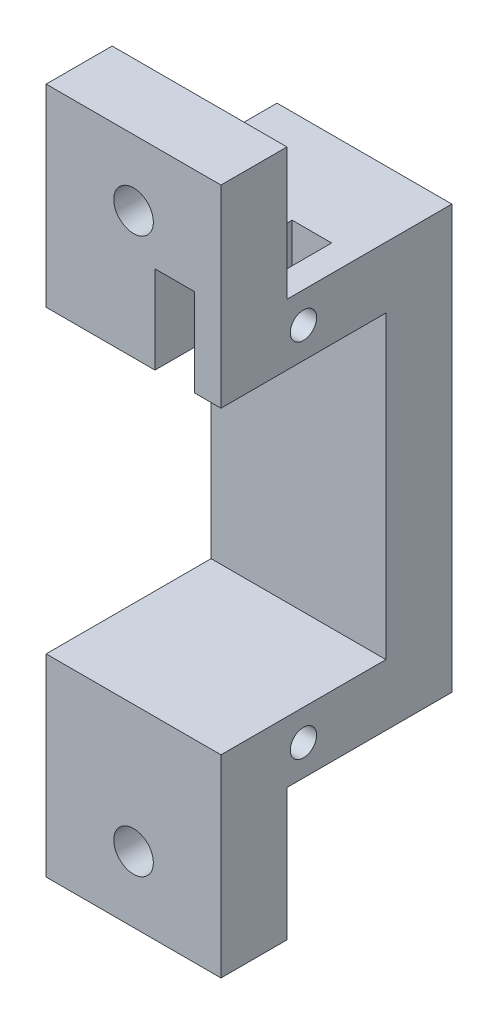
ISO-10303-21;
HEADER;
FILE_DESCRIPTION(('STEP AP214'),'2;1');
FILE_NAME('part.step','',(''),(''),'','','');
FILE_SCHEMA(('AUTOMOTIVE_DESIGN { 1 0 10303 214 1 1 1 1 }'));
ENDSEC;
DATA;
#1=APPLICATION_CONTEXT('core data for automotive mechanical design processes');
#2=APPLICATION_PROTOCOL_DEFINITION('international standard','automotive_design',2000,#1);
#3=PRODUCT_CONTEXT('',#1,'mechanical');
#4=PRODUCT('Part','Part','',(#3));
#5=PRODUCT_RELATED_PRODUCT_CATEGORY('part','',(#4));
#6=PRODUCT_DEFINITION_FORMATION('','',#4);
#7=PRODUCT_DEFINITION_CONTEXT('part definition',#1,'design');
#8=PRODUCT_DEFINITION('design','',#6,#7);
#9=PRODUCT_DEFINITION_SHAPE('','',#8);
#10=(LENGTH_UNIT() NAMED_UNIT(*) SI_UNIT(.MILLI.,.METRE.));
#11=(NAMED_UNIT(*) PLANE_ANGLE_UNIT() SI_UNIT($,.RADIAN.));
#12=(NAMED_UNIT(*) SI_UNIT($,.STERADIAN.) SOLID_ANGLE_UNIT());
#13=UNCERTAINTY_MEASURE_WITH_UNIT(LENGTH_MEASURE(1.E-05),#10,'distance_accuracy_value','');
#14=(GEOMETRIC_REPRESENTATION_CONTEXT(3) GLOBAL_UNCERTAINTY_ASSIGNED_CONTEXT((#13)) GLOBAL_UNIT_ASSIGNED_CONTEXT((#10,
#11,#12)) REPRESENTATION_CONTEXT('',''));
#15=CARTESIAN_POINT('',(0.,0.,0.));
#16=DIRECTION('',(0.,0.,1.));
#17=DIRECTION('',(1.,0.,0.));
#18=AXIS2_PLACEMENT_3D('',#15,#16,#17);
#19=CARTESIAN_POINT('',(-21.7379181981433,-2.325,12.411797698406));
#20=DIRECTION('',(1.,0.,0.));
#21=DIRECTION('',(0.,0.,-1.));
#22=AXIS2_PLACEMENT_3D('',#19,#20,#21);
#23=CYLINDRICAL_SURFACE('',#22,1.);
#24=CARTESIAN_POINT('',(-13.4879181981433,-2.325,12.411797698406));
#25=DIRECTION('',(-1.,0.,0.));
#26=DIRECTION('',(0.,0.,1.));
#27=AXIS2_PLACEMENT_3D('',#24,#25,#26);
#28=CIRCLE('',#27,1.);
#29=CARTESIAN_POINT('',(-13.4879181981433,-2.325,11.411797698406));
#30=VERTEX_POINT('',#29);
#31=EDGE_CURVE('E38',#30,#30,#28,.F.);
#32=CARTESIAN_POINT('',(-21.7379181981433,-2.325,12.411797698406));
#33=DIRECTION('',(1.,0.,0.));
#34=DIRECTION('',(0.,0.,-1.));
#35=AXIS2_PLACEMENT_3D('',#32,#33,#34);
#36=CIRCLE('',#35,1.);
#37=CARTESIAN_POINT('',(-21.7379181981433,-2.325,11.411797698406));
#38=VERTEX_POINT('',#37);
#39=EDGE_CURVE('E303',#38,#38,#36,.T.);
#40=CARTESIAN_POINT('',(-13.4879181981433,-2.325,11.411797698406));
#41=CARTESIAN_POINT('',(-13.5738556981433,-2.325,11.411797698406));
#42=CARTESIAN_POINT('',(-13.6597931981433,-2.325,11.411797698406));
#43=CARTESIAN_POINT('',(-13.8316681981433,-2.325,11.411797698406));
#44=CARTESIAN_POINT('',(-13.9176056981433,-2.325,11.411797698406));
#45=CARTESIAN_POINT('',(-14.0894806981433,-2.325,11.411797698406));
#46=CARTESIAN_POINT('',(-14.1754181981433,-2.325,11.411797698406));
#47=CARTESIAN_POINT('',(-14.3472931981433,-2.325,11.411797698406));
#48=CARTESIAN_POINT('',(-14.4332306981433,-2.325,11.411797698406));
#49=CARTESIAN_POINT('',(-14.6051056981433,-2.325,11.411797698406));
#50=CARTESIAN_POINT('',(-14.6910431981433,-2.325,11.411797698406));
#51=CARTESIAN_POINT('',(-14.8629181981433,-2.325,11.411797698406));
#52=CARTESIAN_POINT('',(-14.9488556981433,-2.325,11.411797698406));
#53=CARTESIAN_POINT('',(-15.1207306981433,-2.325,11.411797698406));
#54=CARTESIAN_POINT('',(-15.2066681981433,-2.325,11.411797698406));
#55=CARTESIAN_POINT('',(-15.3785431981433,-2.325,11.411797698406));
#56=CARTESIAN_POINT('',(-15.4644806981433,-2.325,11.411797698406));
#57=CARTESIAN_POINT('',(-15.6363556981433,-2.325,11.411797698406));
#58=CARTESIAN_POINT('',(-15.7222931981433,-2.325,11.411797698406));
#59=CARTESIAN_POINT('',(-15.8941681981433,-2.325,11.411797698406));
#60=CARTESIAN_POINT('',(-15.9801056981433,-2.325,11.411797698406));
#61=CARTESIAN_POINT('',(-16.1519806981433,-2.325,11.411797698406));
#62=CARTESIAN_POINT('',(-16.2379181981433,-2.325,11.411797698406));
#63=CARTESIAN_POINT('',(-16.4097931981433,-2.325,11.411797698406));
#64=CARTESIAN_POINT('',(-16.4957306981433,-2.325,11.411797698406));
#65=CARTESIAN_POINT('',(-16.6676056981433,-2.325,11.411797698406));
#66=CARTESIAN_POINT('',(-16.7535431981433,-2.325,11.411797698406));
#67=CARTESIAN_POINT('',(-16.9254181981433,-2.325,11.411797698406));
#68=CARTESIAN_POINT('',(-17.0113556981433,-2.325,11.411797698406));
#69=CARTESIAN_POINT('',(-17.1832306981433,-2.325,11.411797698406));
#70=CARTESIAN_POINT('',(-17.2691681981433,-2.325,11.411797698406));
#71=CARTESIAN_POINT('',(-17.4410431981433,-2.325,11.411797698406));
#72=CARTESIAN_POINT('',(-17.5269806981433,-2.325,11.411797698406));
#73=CARTESIAN_POINT('',(-17.6988556981433,-2.325,11.411797698406));
#74=CARTESIAN_POINT('',(-17.7847931981433,-2.325,11.411797698406));
#75=CARTESIAN_POINT('',(-17.9566681981433,-2.325,11.411797698406));
#76=CARTESIAN_POINT('',(-18.0426056981433,-2.325,11.411797698406));
#77=CARTESIAN_POINT('',(-18.2144806981433,-2.325,11.411797698406));
#78=CARTESIAN_POINT('',(-18.3004181981433,-2.325,11.411797698406));
#79=CARTESIAN_POINT('',(-18.4722931981433,-2.325,11.411797698406));
#80=CARTESIAN_POINT('',(-18.5582306981433,-2.325,11.411797698406));
#81=CARTESIAN_POINT('',(-18.7301056981433,-2.325,11.411797698406));
#82=CARTESIAN_POINT('',(-18.8160431981433,-2.325,11.411797698406));
#83=CARTESIAN_POINT('',(-18.9879181981433,-2.325,11.411797698406));
#84=CARTESIAN_POINT('',(-19.0738556981433,-2.325,11.411797698406));
#85=CARTESIAN_POINT('',(-19.2457306981433,-2.325,11.411797698406));
#86=CARTESIAN_POINT('',(-19.3316681981433,-2.325,11.411797698406));
#87=CARTESIAN_POINT('',(-19.5035431981433,-2.325,11.411797698406));
#88=CARTESIAN_POINT('',(-19.5894806981433,-2.325,11.411797698406));
#89=CARTESIAN_POINT('',(-19.7613556981433,-2.325,11.411797698406));
#90=CARTESIAN_POINT('',(-19.8472931981433,-2.325,11.411797698406));
#91=CARTESIAN_POINT('',(-20.0191681981433,-2.325,11.411797698406));
#92=CARTESIAN_POINT('',(-20.1051056981433,-2.325,11.411797698406));
#93=CARTESIAN_POINT('',(-20.2769806981433,-2.325,11.411797698406));
#94=CARTESIAN_POINT('',(-20.3629181981433,-2.325,11.411797698406));
#95=CARTESIAN_POINT('',(-20.5347931981433,-2.325,11.411797698406));
#96=CARTESIAN_POINT('',(-20.6207306981433,-2.325,11.411797698406));
#97=CARTESIAN_POINT('',(-20.7926056981433,-2.325,11.411797698406));
#98=CARTESIAN_POINT('',(-20.8785431981433,-2.325,11.411797698406));
#99=CARTESIAN_POINT('',(-21.0504181981433,-2.325,11.411797698406));
#100=CARTESIAN_POINT('',(-21.1363556981433,-2.325,11.411797698406));
#101=CARTESIAN_POINT('',(-21.3082306981433,-2.325,11.411797698406));
#102=CARTESIAN_POINT('',(-21.3941681981433,-2.325,11.411797698406));
#103=CARTESIAN_POINT('',(-21.5660431981433,-2.325,11.411797698406));
#104=CARTESIAN_POINT('',(-21.6519806981433,-2.325,11.411797698406));
#105=CARTESIAN_POINT('',(-21.7379181981433,-2.325,11.411797698406));
#106=B_SPLINE_CURVE_WITH_KNOTS('',3,(#40,#41,#42,#43,#44,#45,#46,#47,#48,#49,#50,#51,#52,#53,
#54,#55,#56,#57,#58,#59,#60,#61,#62,#63,#64,#65,#66,#67,#68,#69,#70,#71,#72,#73,#74,#75,#76,#77,
#78,#79,#80,#81,#82,#83,#84,#85,#86,#87,#88,#89,#90,#91,#92,#93,#94,#95,#96,#97,#98,#99,#100,
#101,#102,#103,#104,#105),.UNSPECIFIED.,.F.,.F.,(4,2,2,2,2,2,2,2,2,2,2,2,2,2,2,2,2,2,2,2,2,2,2,
2,2,2,2,2,2,2,2,2,4),(0.,0.257812500000001,0.515625,0.7734375,1.03125,1.2890625,1.546875,
1.8046875,2.0625,2.3203125,2.578125,2.83593750000001,3.09375,3.3515625,3.609375,
3.86718750000001,4.12500000000001,4.3828125,4.640625,4.89843750000001,5.15625000000001,
5.41406250000001,5.67187500000001,5.92968750000001,6.18750000000001,6.44531250000001,
6.70312500000001,6.96093750000001,7.21875000000001,7.47656250000001,7.73437500000001,
7.99218750000001,8.25000000000001),.UNSPECIFIED.);
#107=EDGE_CURVE('BSEAM34',#30,#38,#106,.T.);
#108=ORIENTED_EDGE('',*,*,#31,.T.);
#109=ORIENTED_EDGE('',*,*,#39,.F.);
#110=ORIENTED_EDGE('',*,*,#107,.T.);
#111=ORIENTED_EDGE('',*,*,#107,.F.);
#112=EDGE_LOOP('',(#108,#110,#109,#111));
#113=FACE_BOUND('',#112,.T.);
#114=ADVANCED_FACE('F34',(#113),#23,.F.);
#115=CARTESIAN_POINT('',(-21.7379181981433,-32.05,1.16179769840603));
#116=DIRECTION('',(0.,1.,0.));
#117=DIRECTION('',(-1.,0.,0.));
#118=AXIS2_PLACEMENT_3D('',#115,#116,#117);
#119=PLANE('',#118);
#120=DIRECTION('',(1.,0.,0.));
#121=VECTOR('',#120,1.);
#122=CARTESIAN_POINT('',(-21.7379181981433,-32.05,13.661797698406));
#123=LINE('',#122,#121);
#124=CARTESIAN_POINT('',(-21.7379181981433,-32.05,13.661797698406));
#125=VERTEX_POINT('',#124);
#126=CARTESIAN_POINT('',(-8.48791819814331,-32.05,13.661797698406));
#127=VERTEX_POINT('',#126);
#128=EDGE_CURVE('E204',#125,#127,#123,.T.);
#129=ORIENTED_EDGE('',*,*,#128,.F.);
#130=DIRECTION('',(0.,0.,1.));
#131=VECTOR('',#130,1.);
#132=CARTESIAN_POINT('',(-21.7379181981433,-32.05,1.16179769840603));
#133=LINE('',#132,#131);
#134=CARTESIAN_POINT('',(-21.7379181981433,-32.05,1.16179769840603));
#135=VERTEX_POINT('',#134);
#136=EDGE_CURVE('E250',#135,#125,#133,.T.);
#137=ORIENTED_EDGE('',*,*,#136,.F.);
#138=DIRECTION('',(-1.,0.,0.));
#139=VECTOR('',#138,1.);
#140=CARTESIAN_POINT('',(-21.7379181981433,-32.05,1.16179769840603));
#141=LINE('',#140,#139);
#142=CARTESIAN_POINT('',(-8.48791819814331,-32.05,1.16179769840603));
#143=VERTEX_POINT('',#142);
#144=EDGE_CURVE('E248',#143,#135,#141,.T.);
#145=ORIENTED_EDGE('',*,*,#144,.F.);
#146=DIRECTION('',(0.,0.,1.));
#147=VECTOR('',#146,1.);
#148=CARTESIAN_POINT('',(-8.48791819814331,-32.05,1.16179769840603));
#149=LINE('',#148,#147);
#150=EDGE_CURVE('E256',#143,#127,#149,.T.);
#151=ORIENTED_EDGE('',*,*,#150,.T.);
#152=EDGE_LOOP('',(#129,#137,#145,#151));
#153=FACE_BOUND('',#152,.T.);
#154=ADVANCED_FACE('F385',(#153),#119,.F.);
#155=CARTESIAN_POINT('',(0.,0.,6.16179769840603));
#156=DIRECTION('',(0.,0.,1.));
#157=DIRECTION('',(1.,0.,0.));
#158=AXIS2_PLACEMENT_3D('',#155,#156,#157);
#159=PLANE('',#158);
#160=DIRECTION('',(0.,1.,0.));
#161=VECTOR('',#160,1.);
#162=CARTESIAN_POINT('',(-21.7379181981433,0.,6.16179769840603));
#163=LINE('',#162,#161);
#164=CARTESIAN_POINT('',(-21.7379181981433,-27.4,6.16179769840603));
#165=VERTEX_POINT('',#164);
#166=CARTESIAN_POINT('',(-21.7379181981433,-4.65,6.16179769840603));
#167=VERTEX_POINT('',#166);
#168=EDGE_CURVE('E238',#165,#167,#163,.T.);
#169=ORIENTED_EDGE('',*,*,#168,.F.);
#170=DIRECTION('',(-1.,0.,0.));
#171=VECTOR('',#170,1.);
#172=CARTESIAN_POINT('',(-8.48791819814331,-27.4,6.16179769840603));
#173=LINE('',#172,#171);
#174=CARTESIAN_POINT('',(-8.48791819814331,-27.4,6.16179769840603));
#175=VERTEX_POINT('',#174);
#176=EDGE_CURVE('E224',#175,#165,#173,.T.);
#177=ORIENTED_EDGE('',*,*,#176,.F.);
#178=DIRECTION('',(0.,-1.,0.));
#179=VECTOR('',#178,1.);
#180=CARTESIAN_POINT('',(-8.4879181981433,0.,6.16179769840603));
#181=LINE('',#180,#179);
#182=CARTESIAN_POINT('',(-8.4879181981433,-4.65,6.16179769840603));
#183=VERTEX_POINT('',#182);
#184=EDGE_CURVE('E243',#183,#175,#181,.T.);
#185=ORIENTED_EDGE('',*,*,#184,.F.);
#186=DIRECTION('',(-1.,0.,0.));
#187=VECTOR('',#186,1.);
#188=CARTESIAN_POINT('',(-21.7379181981433,-4.65,6.16179769840603));
#189=LINE('',#188,#187);
#190=EDGE_CURVE('E268',#183,#167,#189,.T.);
#191=ORIENTED_EDGE('',*,*,#190,.T.);
#192=EDGE_LOOP('',(#169,#177,#185,#191));
#193=FACE_BOUND('',#192,.T.);
#194=ADVANCED_FACE('F362',(#193),#159,.T.);
#195=CARTESIAN_POINT('',(-21.7379181981433,-4.65,6.16179769840603));
#196=DIRECTION('',(-1.,0.,0.));
#197=DIRECTION('',(0.,0.,1.));
#198=AXIS2_PLACEMENT_3D('',#195,#196,#197);
#199=PLANE('',#198);
#200=CARTESIAN_POINT('',(-21.7379181981433,-29.725,12.411797698406));
#201=DIRECTION('',(1.,0.,0.));
#202=DIRECTION('',(0.,0.,-1.));
#203=AXIS2_PLACEMENT_3D('',#200,#201,#202);
#204=CIRCLE('',#203,1.);
#205=CARTESIAN_POINT('',(-21.7379181981433,-29.725,11.411797698406));
#206=VERTEX_POINT('',#205);
#207=EDGE_CURVE('E297',#206,#206,#204,.T.);
#208=ORIENTED_EDGE('',*,*,#207,.T.);
#209=EDGE_LOOP('',(#208));
#210=FACE_BOUND('',#209,.T.);
#211=ORIENTED_EDGE('',*,*,#39,.T.);
#212=EDGE_LOOP('',(#211));
#213=FACE_BOUND('',#212,.T.);
#214=DIRECTION('',(0.,0.,1.));
#215=VECTOR('',#214,1.);
#216=CARTESIAN_POINT('',(-21.7379181981433,0.,6.16179769840603));
#217=LINE('',#216,#215);
#218=CARTESIAN_POINT('',(-21.7379181981433,0.,1.16179769840603));
#219=VERTEX_POINT('',#218);
#220=CARTESIAN_POINT('',(-21.7379181981433,0.,13.661797698406));
#221=VERTEX_POINT('',#220);
#222=EDGE_CURVE('E187',#219,#221,#217,.T.);
#223=ORIENTED_EDGE('',*,*,#222,.F.);
#224=DIRECTION('',(0.,1.,0.));
#225=VECTOR('',#224,1.);
#226=CARTESIAN_POINT('',(-21.7379181981433,0.,1.16179769840603));
#227=LINE('',#226,#225);
#228=EDGE_CURVE('E239',#135,#219,#227,.T.);
#229=ORIENTED_EDGE('',*,*,#228,.F.);
#230=ORIENTED_EDGE('',*,*,#136,.T.);
#231=DIRECTION('',(0.,1.,0.));
#232=VECTOR('',#231,1.);
#233=CARTESIAN_POINT('',(-21.7379181981433,-42.05,13.661797698406));
#234=LINE('',#233,#232);
#235=CARTESIAN_POINT('',(-21.7379181981433,-42.05,13.661797698406));
#236=VERTEX_POINT('',#235);
#237=EDGE_CURVE('E221',#236,#125,#234,.T.);
#238=ORIENTED_EDGE('',*,*,#237,.F.);
#239=DIRECTION('',(0.,0.,-1.));
#240=VECTOR('',#239,1.);
#241=CARTESIAN_POINT('',(-21.7379181981433,-42.05,18.661797698406));
#242=LINE('',#241,#240);
#243=CARTESIAN_POINT('',(-21.7379181981433,-42.05,18.661797698406));
#244=VERTEX_POINT('',#243);
#245=EDGE_CURVE('E205',#244,#236,#242,.T.);
#246=ORIENTED_EDGE('',*,*,#245,.F.);
#247=DIRECTION('',(0.,-1.,0.));
#248=VECTOR('',#247,1.);
#249=CARTESIAN_POINT('',(-21.7379181981433,-32.05,18.661797698406));
#250=LINE('',#249,#248);
#251=CARTESIAN_POINT('',(-21.7379181981433,-27.4,18.661797698406));
#252=VERTEX_POINT('',#251);
#253=EDGE_CURVE('E230',#252,#244,#250,.T.);
#254=ORIENTED_EDGE('',*,*,#253,.F.);
#255=DIRECTION('',(0.,0.,-1.));
#256=VECTOR('',#255,1.);
#257=CARTESIAN_POINT('',(-21.7379181981433,-27.4,18.661797698406));
#258=LINE('',#257,#256);
#259=EDGE_CURVE('E232',#252,#165,#258,.T.);
#260=ORIENTED_EDGE('',*,*,#259,.T.);
#261=ORIENTED_EDGE('',*,*,#168,.T.);
#262=DIRECTION('',(0.,0.,1.));
#263=VECTOR('',#262,1.);
#264=CARTESIAN_POINT('',(-21.7379181981433,-4.65,6.16179769840603));
#265=LINE('',#264,#263);
#266=CARTESIAN_POINT('',(-21.7379181981433,-4.65,18.661797698406));
#267=VERTEX_POINT('',#266);
#268=EDGE_CURVE('E258',#167,#267,#265,.T.);
#269=ORIENTED_EDGE('',*,*,#268,.T.);
#270=DIRECTION('',(0.,1.,0.));
#271=VECTOR('',#270,1.);
#272=CARTESIAN_POINT('',(-21.7379181981433,-4.65,18.661797698406));
#273=LINE('',#272,#271);
#274=CARTESIAN_POINT('',(-21.7379181981433,10.,18.661797698406));
#275=VERTEX_POINT('',#274);
#276=EDGE_CURVE('E43',#267,#275,#273,.T.);
#277=ORIENTED_EDGE('',*,*,#276,.T.);
#278=DIRECTION('',(0.,0.,1.));
#279=VECTOR('',#278,1.);
#280=CARTESIAN_POINT('',(-21.7379181981433,10.,18.661797698406));
#281=LINE('',#280,#279);
#282=CARTESIAN_POINT('',(-21.7379181981433,10.,13.661797698406));
#283=VERTEX_POINT('',#282);
#284=EDGE_CURVE('E191',#283,#275,#281,.T.);
#285=ORIENTED_EDGE('',*,*,#284,.F.);
#286=DIRECTION('',(0.,-1.,0.));
#287=VECTOR('',#286,1.);
#288=CARTESIAN_POINT('',(-21.7379181981433,10.,13.661797698406));
#289=LINE('',#288,#287);
#290=EDGE_CURVE('E199',#283,#221,#289,.T.);
#291=ORIENTED_EDGE('',*,*,#290,.T.);
#292=EDGE_LOOP('',(#223,#229,#230,#238,#246,#254,#260,#261,#269,#277,#285,#291));
#293=FACE_BOUND('',#292,.T.);
#294=ADVANCED_FACE('F36',(#210,#213,#293),#199,.T.);
#295=CARTESIAN_POINT('',(-8.4879181981433,-4.65,6.16179769840603));
#296=DIRECTION('',(1.,0.,0.));
#297=DIRECTION('',(0.,0.,-1.));
#298=AXIS2_PLACEMENT_3D('',#295,#296,#297);
#299=PLANE('',#298);
#300=CARTESIAN_POINT('',(-8.4879181981433,-29.725,12.411797698406));
#301=DIRECTION('',(1.,0.,0.));
#302=DIRECTION('',(0.,0.,-1.));
#303=AXIS2_PLACEMENT_3D('',#300,#301,#302);
#304=CIRCLE('',#303,1.);
#305=CARTESIAN_POINT('',(-8.4879181981433,-29.725,11.411797698406));
#306=VERTEX_POINT('',#305);
#307=EDGE_CURVE('E296',#306,#306,#304,.T.);
#308=ORIENTED_EDGE('',*,*,#307,.F.);
#309=EDGE_LOOP('',(#308));
#310=FACE_BOUND('',#309,.T.);
#311=CARTESIAN_POINT('',(-8.4879181981433,-2.325,12.411797698406));
#312=DIRECTION('',(1.,0.,0.));
#313=DIRECTION('',(0.,0.,-1.));
#314=AXIS2_PLACEMENT_3D('',#311,#312,#313);
#315=CIRCLE('',#314,1.);
#316=CARTESIAN_POINT('',(-8.4879181981433,-2.325,11.411797698406));
#317=VERTEX_POINT('',#316);
#318=EDGE_CURVE('E300',#317,#317,#315,.T.);
#319=ORIENTED_EDGE('',*,*,#318,.F.);
#320=EDGE_LOOP('',(#319));
#321=FACE_BOUND('',#320,.T.);
#322=DIRECTION('',(0.,0.,-1.));
#323=VECTOR('',#322,1.);
#324=CARTESIAN_POINT('',(-8.4879181981433,0.,6.16179769840603));
#325=LINE('',#324,#323);
#326=CARTESIAN_POINT('',(-8.4879181981433,0.,13.661797698406));
#327=VERTEX_POINT('',#326);
#328=CARTESIAN_POINT('',(-8.4879181981433,0.,1.16179769840603));
#329=VERTEX_POINT('',#328);
#330=EDGE_CURVE('E262',#327,#329,#325,.T.);
#331=ORIENTED_EDGE('',*,*,#330,.F.);
#332=DIRECTION('',(0.,-1.,0.));
#333=VECTOR('',#332,1.);
#334=CARTESIAN_POINT('',(-8.4879181981433,10.,13.661797698406));
#335=LINE('',#334,#333);
#336=CARTESIAN_POINT('',(-8.4879181981433,10.,13.661797698406));
#337=VERTEX_POINT('',#336);
#338=EDGE_CURVE('E201',#337,#327,#335,.T.);
#339=ORIENTED_EDGE('',*,*,#338,.F.);
#340=DIRECTION('',(0.,0.,-1.));
#341=VECTOR('',#340,1.);
#342=CARTESIAN_POINT('',(-8.4879181981433,10.,18.661797698406));
#343=LINE('',#342,#341);
#344=CARTESIAN_POINT('',(-8.4879181981433,10.,18.661797698406));
#345=VERTEX_POINT('',#344);
#346=EDGE_CURVE('E320',#345,#337,#343,.T.);
#347=ORIENTED_EDGE('',*,*,#346,.F.);
#348=DIRECTION('',(0.,1.,0.));
#349=VECTOR('',#348,1.);
#350=CARTESIAN_POINT('',(-8.4879181981433,-4.65,18.661797698406));
#351=LINE('',#350,#349);
#352=CARTESIAN_POINT('',(-8.4879181981433,-4.65,18.661797698406));
#353=VERTEX_POINT('',#352);
#354=EDGE_CURVE('E11',#353,#345,#351,.T.);
#355=ORIENTED_EDGE('',*,*,#354,.F.);
#356=DIRECTION('',(0.,0.,-1.));
#357=VECTOR('',#356,1.);
#358=CARTESIAN_POINT('',(-8.4879181981433,-4.65,6.16179769840603));
#359=LINE('',#358,#357);
#360=EDGE_CURVE('E266',#353,#183,#359,.T.);
#361=ORIENTED_EDGE('',*,*,#360,.T.);
#362=ORIENTED_EDGE('',*,*,#184,.T.);
#363=DIRECTION('',(0.,0.,-1.));
#364=VECTOR('',#363,1.);
#365=CARTESIAN_POINT('',(-8.48791819814331,-27.4,18.661797698406));
#366=LINE('',#365,#364);
#367=CARTESIAN_POINT('',(-8.48791819814331,-27.4,18.661797698406));
#368=VERTEX_POINT('',#367);
#369=EDGE_CURVE('E236',#368,#175,#366,.T.);
#370=ORIENTED_EDGE('',*,*,#369,.F.);
#371=DIRECTION('',(0.,1.,0.));
#372=VECTOR('',#371,1.);
#373=CARTESIAN_POINT('',(-8.48791819814331,-32.05,18.661797698406));
#374=LINE('',#373,#372);
#375=CARTESIAN_POINT('',(-8.48791819814331,-42.05,18.661797698406));
#376=VERTEX_POINT('',#375);
#377=EDGE_CURVE('E225',#376,#368,#374,.T.);
#378=ORIENTED_EDGE('',*,*,#377,.F.);
#379=DIRECTION('',(0.,0.,1.));
#380=VECTOR('',#379,1.);
#381=CARTESIAN_POINT('',(-8.48791819814331,-42.05,18.661797698406));
#382=LINE('',#381,#380);
#383=CARTESIAN_POINT('',(-8.48791819814331,-42.05,13.661797698406));
#384=VERTEX_POINT('',#383);
#385=EDGE_CURVE('E210',#384,#376,#382,.T.);
#386=ORIENTED_EDGE('',*,*,#385,.F.);
#387=DIRECTION('',(0.,1.,0.));
#388=VECTOR('',#387,1.);
#389=CARTESIAN_POINT('',(-8.48791819814331,-42.05,13.661797698406));
#390=LINE('',#389,#388);
#391=EDGE_CURVE('E216',#384,#127,#390,.T.);
#392=ORIENTED_EDGE('',*,*,#391,.T.);
#393=ORIENTED_EDGE('',*,*,#150,.F.);
#394=DIRECTION('',(0.,-1.,0.));
#395=VECTOR('',#394,1.);
#396=CARTESIAN_POINT('',(-8.4879181981433,0.,1.16179769840603));
#397=LINE('',#396,#395);
#398=EDGE_CURVE('E246',#329,#143,#397,.T.);
#399=ORIENTED_EDGE('',*,*,#398,.F.);
#400=EDGE_LOOP('',(#331,#339,#347,#355,#361,#362,#370,#378,#386,#392,#393,#399));
#401=FACE_BOUND('',#400,.T.);
#402=ADVANCED_FACE('F337',(#310,#321,#401),#299,.T.);
#403=CARTESIAN_POINT('',(-21.7379181981433,-4.65,18.661797698406));
#404=DIRECTION('',(0.,0.,1.));
#405=DIRECTION('',(1.,0.,0.));
#406=AXIS2_PLACEMENT_3D('',#403,#404,#405);
#407=PLANE('',#406);
#408=DIRECTION('',(-1.,0.,0.));
#409=VECTOR('',#408,1.);
#410=CARTESIAN_POINT('',(-21.7379181981433,2.,18.661797698406));
#411=LINE('',#410,#409);
#412=CARTESIAN_POINT('',(-10.4879181981433,2.,18.661797698406));
#413=VERTEX_POINT('',#412);
#414=CARTESIAN_POINT('',(-13.4879181981433,2.,18.661797698406));
#415=VERTEX_POINT('',#414);
#416=EDGE_CURVE('E183',#413,#415,#411,.T.);
#417=ORIENTED_EDGE('',*,*,#416,.F.);
#418=DIRECTION('',(0.,1.,0.));
#419=VECTOR('',#418,1.);
#420=CARTESIAN_POINT('',(-10.4879181981433,-10.,18.661797698406));
#421=LINE('',#420,#419);
#422=CARTESIAN_POINT('',(-10.4879181981433,-4.65,18.661797698406));
#423=VERTEX_POINT('',#422);
#424=EDGE_CURVE('E281',#423,#413,#421,.T.);
#425=ORIENTED_EDGE('',*,*,#424,.F.);
#426=DIRECTION('',(1.,0.,0.));
#427=VECTOR('',#426,1.);
#428=CARTESIAN_POINT('',(-21.7379181981433,-4.65,18.661797698406));
#429=LINE('',#428,#427);
#430=EDGE_CURVE('E261',#423,#353,#429,.T.);
#431=ORIENTED_EDGE('',*,*,#430,.T.);
#432=ORIENTED_EDGE('',*,*,#354,.T.);
#433=DIRECTION('',(1.,0.,0.));
#434=VECTOR('',#433,1.);
#435=CARTESIAN_POINT('',(-21.7379181981433,10.,18.661797698406));
#436=LINE('',#435,#434);
#437=EDGE_CURVE('E318',#275,#345,#436,.T.);
#438=ORIENTED_EDGE('',*,*,#437,.F.);
#439=ORIENTED_EDGE('',*,*,#276,.F.);
#440=CARTESIAN_POINT('',(-13.4879181981433,-4.65,18.661797698406));
#441=VERTEX_POINT('',#440);
#442=EDGE_CURVE('E263',#267,#441,#429,.T.);
#443=ORIENTED_EDGE('',*,*,#442,.T.);
#444=DIRECTION('',(0.,1.,0.));
#445=VECTOR('',#444,1.);
#446=CARTESIAN_POINT('',(-13.4879181981433,-10.,18.661797698406));
#447=LINE('',#446,#445);
#448=EDGE_CURVE('E288',#441,#415,#447,.T.);
#449=ORIENTED_EDGE('',*,*,#448,.T.);
#450=EDGE_LOOP('',(#417,#425,#431,#432,#438,#439,#443,#449));
#451=FACE_BOUND('',#450,.T.);
#452=CARTESIAN_POINT('',(-15.1129181981433,5.,18.661797698406));
#453=DIRECTION('',(0.,0.,1.));
#454=DIRECTION('',(1.,0.,0.));
#455=AXIS2_PLACEMENT_3D('',#452,#453,#454);
#456=CIRCLE('',#455,1.5);
#457=CARTESIAN_POINT('',(-13.6129181981433,5.,18.661797698406));
#458=VERTEX_POINT('',#457);
#459=EDGE_CURVE('E189',#458,#458,#456,.T.);
#460=ORIENTED_EDGE('',*,*,#459,.F.);
#461=EDGE_LOOP('',(#460));
#462=FACE_BOUND('',#461,.T.);
#463=ADVANCED_FACE('F333',(#451,#462),#407,.T.);
#464=CARTESIAN_POINT('',(0.,-4.65,0.));
#465=DIRECTION('',(0.,1.,0.));
#466=DIRECTION('',(0.,0.,1.));
#467=AXIS2_PLACEMENT_3D('',#464,#465,#466);
#468=PLANE('',#467);
#469=DIRECTION('',(-1.,0.,0.));
#470=VECTOR('',#469,1.);
#471=CARTESIAN_POINT('',(0.,-4.65,8.27082062568252));
#472=LINE('',#471,#470);
#473=CARTESIAN_POINT('',(-10.4879181981433,-4.65,8.27082062568252));
#474=VERTEX_POINT('',#473);
#475=CARTESIAN_POINT('',(-13.4879181981433,-4.65,8.27082062568252));
#476=VERTEX_POINT('',#475);
#477=EDGE_CURVE('E293',#474,#476,#472,.T.);
#478=ORIENTED_EDGE('',*,*,#477,.T.);
#479=DIRECTION('',(0.,0.,1.));
#480=VECTOR('',#479,1.);
#481=CARTESIAN_POINT('',(-13.4879181981433,-4.65,0.));
#482=LINE('',#481,#480);
#483=EDGE_CURVE('E290',#476,#441,#482,.T.);
#484=ORIENTED_EDGE('',*,*,#483,.T.);
#485=ORIENTED_EDGE('',*,*,#442,.F.);
#486=ORIENTED_EDGE('',*,*,#268,.F.);
#487=ORIENTED_EDGE('',*,*,#190,.F.);
#488=ORIENTED_EDGE('',*,*,#360,.F.);
#489=ORIENTED_EDGE('',*,*,#430,.F.);
#490=DIRECTION('',(0.,0.,-1.));
#491=VECTOR('',#490,1.);
#492=CARTESIAN_POINT('',(-10.4879181981433,-4.65,0.));
#493=LINE('',#492,#491);
#494=EDGE_CURVE('E275',#423,#474,#493,.T.);
#495=ORIENTED_EDGE('',*,*,#494,.T.);
#496=EDGE_LOOP('',(#478,#484,#485,#486,#487,#488,#489,#495));
#497=FACE_BOUND('',#496,.T.);
#498=ADVANCED_FACE('F352',(#497),#468,.F.);
#499=CARTESIAN_POINT('',(0.,0.,0.));
#500=DIRECTION('',(0.,1.,0.));
#501=DIRECTION('',(0.,0.,1.));
#502=AXIS2_PLACEMENT_3D('',#499,#500,#501);
#503=PLANE('',#502);
#504=DIRECTION('',(0.,0.,1.));
#505=VECTOR('',#504,1.);
#506=CARTESIAN_POINT('',(-13.4879181981433,0.,18.661797698406));
#507=LINE('',#506,#505);
#508=CARTESIAN_POINT('',(-13.4879181981433,0.,8.27082062568252));
#509=VERTEX_POINT('',#508);
#510=CARTESIAN_POINT('',(-13.4879181981433,0.,13.661797698406));
#511=VERTEX_POINT('',#510);
#512=EDGE_CURVE('E176',#509,#511,#507,.T.);
#513=ORIENTED_EDGE('',*,*,#512,.F.);
#514=DIRECTION('',(-1.,0.,0.));
#515=VECTOR('',#514,1.);
#516=CARTESIAN_POINT('',(-13.4879181981433,0.,8.27082062568252));
#517=LINE('',#516,#515);
#518=CARTESIAN_POINT('',(-10.4879181981433,0.,8.27082062568252));
#519=VERTEX_POINT('',#518);
#520=EDGE_CURVE('E284',#519,#509,#517,.T.);
#521=ORIENTED_EDGE('',*,*,#520,.F.);
#522=DIRECTION('',(0.,0.,-1.));
#523=VECTOR('',#522,1.);
#524=CARTESIAN_POINT('',(-10.4879181981433,0.,18.661797698406));
#525=LINE('',#524,#523);
#526=CARTESIAN_POINT('',(-10.4879181981433,0.,13.661797698406));
#527=VERTEX_POINT('',#526);
#528=EDGE_CURVE('E182',#527,#519,#525,.T.);
#529=ORIENTED_EDGE('',*,*,#528,.F.);
#530=DIRECTION('',(-1.,0.,0.));
#531=VECTOR('',#530,1.);
#532=CARTESIAN_POINT('',(-21.7379181981433,0.,13.661797698406));
#533=LINE('',#532,#531);
#534=EDGE_CURVE('E59',#327,#527,#533,.T.);
#535=ORIENTED_EDGE('',*,*,#534,.F.);
#536=ORIENTED_EDGE('',*,*,#330,.T.);
#537=DIRECTION('',(1.,0.,0.));
#538=VECTOR('',#537,1.);
#539=CARTESIAN_POINT('',(-21.7379181981433,0.,1.16179769840603));
#540=LINE('',#539,#538);
#541=EDGE_CURVE('E242',#219,#329,#540,.T.);
#542=ORIENTED_EDGE('',*,*,#541,.F.);
#543=ORIENTED_EDGE('',*,*,#222,.T.);
#544=EDGE_CURVE('E166',#511,#221,#533,.T.);
#545=ORIENTED_EDGE('',*,*,#544,.F.);
#546=EDGE_LOOP('',(#513,#521,#529,#535,#536,#542,#543,#545));
#547=FACE_BOUND('',#546,.T.);
#548=ADVANCED_FACE('F185',(#547),#503,.T.);
#549=CARTESIAN_POINT('',(0.,0.,1.16179769840603));
#550=DIRECTION('',(0.,0.,1.));
#551=DIRECTION('',(1.,0.,0.));
#552=AXIS2_PLACEMENT_3D('',#549,#550,#551);
#553=PLANE('',#552);
#554=ORIENTED_EDGE('',*,*,#228,.T.);
#555=ORIENTED_EDGE('',*,*,#541,.T.);
#556=ORIENTED_EDGE('',*,*,#398,.T.);
#557=ORIENTED_EDGE('',*,*,#144,.T.);
#558=EDGE_LOOP('',(#554,#555,#556,#557));
#559=FACE_BOUND('',#558,.T.);
#560=ADVANCED_FACE('F387',(#559),#553,.F.);
#561=CARTESIAN_POINT('',(-8.48791819814331,-27.4,18.661797698406));
#562=DIRECTION('',(0.,-1.,0.));
#563=DIRECTION('',(1.,0.,0.));
#564=AXIS2_PLACEMENT_3D('',#561,#562,#563);
#565=PLANE('',#564);
#566=ORIENTED_EDGE('',*,*,#176,.T.);
#567=ORIENTED_EDGE('',*,*,#259,.F.);
#568=DIRECTION('',(-1.,0.,0.));
#569=VECTOR('',#568,1.);
#570=CARTESIAN_POINT('',(-8.48791819814331,-27.4,18.661797698406));
#571=LINE('',#570,#569);
#572=EDGE_CURVE('E228',#368,#252,#571,.T.);
#573=ORIENTED_EDGE('',*,*,#572,.F.);
#574=ORIENTED_EDGE('',*,*,#369,.T.);
#575=EDGE_LOOP('',(#566,#567,#573,#574));
#576=FACE_BOUND('',#575,.T.);
#577=ADVANCED_FACE('F367',(#576),#565,.F.);
#578=CARTESIAN_POINT('',(0.,0.,18.661797698406));
#579=DIRECTION('',(0.,0.,1.));
#580=DIRECTION('',(1.,0.,0.));
#581=AXIS2_PLACEMENT_3D('',#578,#579,#580);
#582=PLANE('',#581);
#583=CARTESIAN_POINT('',(-15.1129181981433,-37.05,18.661797698406));
#584=DIRECTION('',(0.,0.,1.));
#585=DIRECTION('',(1.,0.,0.));
#586=AXIS2_PLACEMENT_3D('',#583,#584,#585);
#587=CIRCLE('',#586,1.5);
#588=CARTESIAN_POINT('',(-13.6129181981433,-37.05,18.661797698406));
#589=VERTEX_POINT('',#588);
#590=EDGE_CURVE('E311',#589,#589,#587,.T.);
#591=ORIENTED_EDGE('',*,*,#590,.F.);
#592=EDGE_LOOP('',(#591));
#593=FACE_BOUND('',#592,.T.);
#594=ORIENTED_EDGE('',*,*,#377,.T.);
#595=ORIENTED_EDGE('',*,*,#572,.T.);
#596=ORIENTED_EDGE('',*,*,#253,.T.);
#597=DIRECTION('',(-1.,0.,0.));
#598=VECTOR('',#597,1.);
#599=CARTESIAN_POINT('',(-21.7379181981433,-42.05,18.661797698406));
#600=LINE('',#599,#598);
#601=EDGE_CURVE('E213',#376,#244,#600,.T.);
#602=ORIENTED_EDGE('',*,*,#601,.F.);
#603=EDGE_LOOP('',(#594,#595,#596,#602));
#604=FACE_BOUND('',#603,.T.);
#605=ADVANCED_FACE('F372',(#593,#604),#582,.T.);
#606=CARTESIAN_POINT('',(-21.7379181981433,-42.05,13.661797698406));
#607=DIRECTION('',(0.,0.,1.));
#608=DIRECTION('',(1.,0.,0.));
#609=AXIS2_PLACEMENT_3D('',#606,#607,#608);
#610=PLANE('',#609);
#611=CARTESIAN_POINT('',(-15.1129181981433,-37.05,13.661797698406));
#612=DIRECTION('',(0.,0.,-1.));
#613=DIRECTION('',(-1.,0.,0.));
#614=AXIS2_PLACEMENT_3D('',#611,#612,#613);
#615=CIRCLE('',#614,1.5);
#616=CARTESIAN_POINT('',(-16.6129181981433,-37.05,13.661797698406));
#617=VERTEX_POINT('',#616);
#618=EDGE_CURVE('E306',#617,#617,#615,.T.);
#619=ORIENTED_EDGE('',*,*,#618,.F.);
#620=EDGE_LOOP('',(#619));
#621=FACE_BOUND('',#620,.T.);
#622=ORIENTED_EDGE('',*,*,#128,.T.);
#623=ORIENTED_EDGE('',*,*,#391,.F.);
#624=DIRECTION('',(1.,0.,0.));
#625=VECTOR('',#624,1.);
#626=CARTESIAN_POINT('',(-21.7379181981433,-42.05,13.661797698406));
#627=LINE('',#626,#625);
#628=EDGE_CURVE('E208',#236,#384,#627,.T.);
#629=ORIENTED_EDGE('',*,*,#628,.F.);
#630=ORIENTED_EDGE('',*,*,#237,.T.);
#631=EDGE_LOOP('',(#622,#623,#629,#630));
#632=FACE_BOUND('',#631,.T.);
#633=ADVANCED_FACE('F380',(#621,#632),#610,.F.);
#634=CARTESIAN_POINT('',(0.,-42.05,0.));
#635=DIRECTION('',(0.,-1.,0.));
#636=DIRECTION('',(1.,0.,0.));
#637=AXIS2_PLACEMENT_3D('',#634,#635,#636);
#638=PLANE('',#637);
#639=ORIENTED_EDGE('',*,*,#245,.T.);
#640=ORIENTED_EDGE('',*,*,#628,.T.);
#641=ORIENTED_EDGE('',*,*,#385,.T.);
#642=ORIENTED_EDGE('',*,*,#601,.T.);
#643=EDGE_LOOP('',(#639,#640,#641,#642));
#644=FACE_BOUND('',#643,.T.);
#645=ADVANCED_FACE('F375',(#644),#638,.T.);
#646=CARTESIAN_POINT('',(-21.7379181981433,10.,13.661797698406));
#647=DIRECTION('',(0.,0.,1.));
#648=DIRECTION('',(1.,0.,0.));
#649=AXIS2_PLACEMENT_3D('',#646,#647,#648);
#650=PLANE('',#649);
#651=CARTESIAN_POINT('',(-15.1129181981433,5.,13.661797698406));
#652=DIRECTION('',(0.,0.,-1.));
#653=DIRECTION('',(-1.,0.,0.));
#654=AXIS2_PLACEMENT_3D('',#651,#652,#653);
#655=CIRCLE('',#654,1.5);
#656=CARTESIAN_POINT('',(-16.6129181981433,5.,13.661797698406));
#657=VERTEX_POINT('',#656);
#658=EDGE_CURVE('E193',#657,#657,#655,.T.);
#659=ORIENTED_EDGE('',*,*,#658,.F.);
#660=EDGE_LOOP('',(#659));
#661=FACE_BOUND('',#660,.T.);
#662=ORIENTED_EDGE('',*,*,#534,.T.);
#663=DIRECTION('',(0.,-1.,0.));
#664=VECTOR('',#663,1.);
#665=CARTESIAN_POINT('',(-10.4879181981433,0.,13.661797698406));
#666=LINE('',#665,#664);
#667=CARTESIAN_POINT('',(-10.4879181981433,2.,13.661797698406));
#668=VERTEX_POINT('',#667);
#669=EDGE_CURVE('E173',#668,#527,#666,.T.);
#670=ORIENTED_EDGE('',*,*,#669,.F.);
#671=DIRECTION('',(1.,0.,0.));
#672=VECTOR('',#671,1.);
#673=CARTESIAN_POINT('',(-10.4879181981433,2.,13.661797698406));
#674=LINE('',#673,#672);
#675=CARTESIAN_POINT('',(-13.4879181981433,2.,13.661797698406));
#676=VERTEX_POINT('',#675);
#677=EDGE_CURVE('E170',#676,#668,#674,.T.);
#678=ORIENTED_EDGE('',*,*,#677,.F.);
#679=DIRECTION('',(0.,1.,0.));
#680=VECTOR('',#679,1.);
#681=CARTESIAN_POINT('',(-13.4879181981433,0.,13.661797698406));
#682=LINE('',#681,#680);
#683=EDGE_CURVE('E161',#511,#676,#682,.T.);
#684=ORIENTED_EDGE('',*,*,#683,.F.);
#685=ORIENTED_EDGE('',*,*,#544,.T.);
#686=ORIENTED_EDGE('',*,*,#290,.F.);
#687=DIRECTION('',(-1.,0.,0.));
#688=VECTOR('',#687,1.);
#689=CARTESIAN_POINT('',(-21.7379181981433,10.,13.661797698406));
#690=LINE('',#689,#688);
#691=EDGE_CURVE('E197',#337,#283,#690,.T.);
#692=ORIENTED_EDGE('',*,*,#691,.F.);
#693=ORIENTED_EDGE('',*,*,#338,.T.);
#694=EDGE_LOOP('',(#662,#670,#678,#684,#685,#686,#692,#693));
#695=FACE_BOUND('',#694,.T.);
#696=ADVANCED_FACE('F163',(#661,#695),#650,.F.);
#697=CARTESIAN_POINT('',(0.,10.,0.));
#698=DIRECTION('',(0.,-1.,0.));
#699=DIRECTION('',(0.,0.,-1.));
#700=AXIS2_PLACEMENT_3D('',#697,#698,#699);
#701=PLANE('',#700);
#702=ORIENTED_EDGE('',*,*,#284,.T.);
#703=ORIENTED_EDGE('',*,*,#437,.T.);
#704=ORIENTED_EDGE('',*,*,#346,.T.);
#705=ORIENTED_EDGE('',*,*,#691,.T.);
#706=EDGE_LOOP('',(#702,#703,#704,#705));
#707=FACE_BOUND('',#706,.T.);
#708=ADVANCED_FACE('F325',(#707),#701,.F.);
#709=CARTESIAN_POINT('',(-15.1129181981433,5.,23.661797698406));
#710=DIRECTION('',(0.,0.,-1.));
#711=DIRECTION('',(-1.,0.,0.));
#712=AXIS2_PLACEMENT_3D('',#709,#710,#711);
#713=CYLINDRICAL_SURFACE('',#712,1.5);
#714=ORIENTED_EDGE('',*,*,#459,.T.);
#715=EDGE_LOOP('',(#714));
#716=FACE_BOUND('',#715,.T.);
#717=ORIENTED_EDGE('',*,*,#658,.T.);
#718=EDGE_LOOP('',(#717));
#719=FACE_BOUND('',#718,.T.);
#720=ADVANCED_FACE('F417',(#716,#719),#713,.F.);
#721=CARTESIAN_POINT('',(-15.1129181981433,-37.05,23.661797698406));
#722=DIRECTION('',(0.,0.,-1.));
#723=DIRECTION('',(-1.,0.,0.));
#724=AXIS2_PLACEMENT_3D('',#721,#722,#723);
#725=CYLINDRICAL_SURFACE('',#724,1.5);
#726=ORIENTED_EDGE('',*,*,#590,.T.);
#727=EDGE_LOOP('',(#726));
#728=FACE_BOUND('',#727,.T.);
#729=ORIENTED_EDGE('',*,*,#618,.T.);
#730=EDGE_LOOP('',(#729));
#731=FACE_BOUND('',#730,.T.);
#732=ADVANCED_FACE('F411',(#728,#731),#725,.F.);
#733=CARTESIAN_POINT('',(-10.4879181981433,-2.325,12.411797698406));
#734=DIRECTION('',(1.,0.,0.));
#735=DIRECTION('',(0.,0.,-1.));
#736=AXIS2_PLACEMENT_3D('',#733,#734,#735);
#737=CIRCLE('',#736,1.);
#738=CARTESIAN_POINT('',(-10.4879181981433,-2.325,11.411797698406));
#739=VERTEX_POINT('',#738);
#740=EDGE_CURVE('E273',#739,#739,#737,.F.);
#741=CARTESIAN_POINT('',(-10.4879181981433,-2.325,11.411797698406));
#742=CARTESIAN_POINT('',(-10.46708486481,-2.325,11.411797698406));
#743=CARTESIAN_POINT('',(-10.4462515314766,-2.325,11.411797698406));
#744=CARTESIAN_POINT('',(-10.40458486481,-2.325,11.411797698406));
#745=CARTESIAN_POINT('',(-10.3837515314766,-2.325,11.411797698406));
#746=CARTESIAN_POINT('',(-10.34208486481,-2.325,11.411797698406));
#747=CARTESIAN_POINT('',(-10.3212515314766,-2.325,11.411797698406));
#748=CARTESIAN_POINT('',(-10.27958486481,-2.325,11.411797698406));
#749=CARTESIAN_POINT('',(-10.2587515314766,-2.325,11.411797698406));
#750=CARTESIAN_POINT('',(-10.21708486481,-2.325,11.411797698406));
#751=CARTESIAN_POINT('',(-10.1962515314766,-2.325,11.411797698406));
#752=CARTESIAN_POINT('',(-10.15458486481,-2.325,11.411797698406));
#753=CARTESIAN_POINT('',(-10.1337515314766,-2.325,11.411797698406));
#754=CARTESIAN_POINT('',(-10.09208486481,-2.325,11.411797698406));
#755=CARTESIAN_POINT('',(-10.0712515314766,-2.325,11.411797698406));
#756=CARTESIAN_POINT('',(-10.02958486481,-2.325,11.411797698406));
#757=CARTESIAN_POINT('',(-10.0087515314766,-2.325,11.411797698406));
#758=CARTESIAN_POINT('',(-9.96708486480997,-2.325,11.411797698406));
#759=CARTESIAN_POINT('',(-9.94625153147664,-2.325,11.411797698406));
#760=CARTESIAN_POINT('',(-9.90458486480997,-2.325,11.411797698406));
#761=CARTESIAN_POINT('',(-9.88375153147664,-2.325,11.411797698406));
#762=CARTESIAN_POINT('',(-9.84208486480997,-2.325,11.411797698406));
#763=CARTESIAN_POINT('',(-9.82125153147664,-2.325,11.411797698406));
#764=CARTESIAN_POINT('',(-9.77958486480997,-2.325,11.411797698406));
#765=CARTESIAN_POINT('',(-9.75875153147664,-2.325,11.411797698406));
#766=CARTESIAN_POINT('',(-9.71708486480997,-2.325,11.411797698406));
#767=CARTESIAN_POINT('',(-9.69625153147664,-2.325,11.411797698406));
#768=CARTESIAN_POINT('',(-9.65458486480997,-2.325,11.411797698406));
#769=CARTESIAN_POINT('',(-9.63375153147664,-2.325,11.411797698406));
#770=CARTESIAN_POINT('',(-9.59208486480997,-2.325,11.411797698406));
#771=CARTESIAN_POINT('',(-9.57125153147664,-2.325,11.411797698406));
#772=CARTESIAN_POINT('',(-9.52958486480997,-2.325,11.411797698406));
#773=CARTESIAN_POINT('',(-9.50875153147664,-2.325,11.411797698406));
#774=CARTESIAN_POINT('',(-9.46708486480997,-2.325,11.411797698406));
#775=CARTESIAN_POINT('',(-9.44625153147664,-2.325,11.411797698406));
#776=CARTESIAN_POINT('',(-9.40458486480997,-2.325,11.411797698406));
#777=CARTESIAN_POINT('',(-9.38375153147664,-2.325,11.411797698406));
#778=CARTESIAN_POINT('',(-9.34208486480997,-2.325,11.411797698406));
#779=CARTESIAN_POINT('',(-9.32125153147664,-2.325,11.411797698406));
#780=CARTESIAN_POINT('',(-9.27958486480997,-2.325,11.411797698406));
#781=CARTESIAN_POINT('',(-9.25875153147664,-2.325,11.411797698406));
#782=CARTESIAN_POINT('',(-9.21708486480997,-2.325,11.411797698406));
#783=CARTESIAN_POINT('',(-9.19625153147664,-2.325,11.411797698406));
#784=CARTESIAN_POINT('',(-9.15458486480997,-2.325,11.411797698406));
#785=CARTESIAN_POINT('',(-9.13375153147664,-2.325,11.411797698406));
#786=CARTESIAN_POINT('',(-9.09208486480997,-2.325,11.411797698406));
#787=CARTESIAN_POINT('',(-9.07125153147664,-2.325,11.411797698406));
#788=CARTESIAN_POINT('',(-9.02958486480997,-2.325,11.411797698406));
#789=CARTESIAN_POINT('',(-9.00875153147664,-2.325,11.411797698406));
#790=CARTESIAN_POINT('',(-8.96708486480997,-2.325,11.411797698406));
#791=CARTESIAN_POINT('',(-8.94625153147664,-2.325,11.411797698406));
#792=CARTESIAN_POINT('',(-8.90458486480997,-2.325,11.411797698406));
#793=CARTESIAN_POINT('',(-8.88375153147664,-2.325,11.411797698406));
#794=CARTESIAN_POINT('',(-8.84208486480997,-2.325,11.411797698406));
#795=CARTESIAN_POINT('',(-8.82125153147664,-2.325,11.411797698406));
#796=CARTESIAN_POINT('',(-8.77958486480997,-2.325,11.411797698406));
#797=CARTESIAN_POINT('',(-8.75875153147664,-2.325,11.411797698406));
#798=CARTESIAN_POINT('',(-8.71708486480997,-2.325,11.411797698406));
#799=CARTESIAN_POINT('',(-8.69625153147664,-2.325,11.411797698406));
#800=CARTESIAN_POINT('',(-8.65458486480997,-2.325,11.411797698406));
#801=CARTESIAN_POINT('',(-8.63375153147664,-2.325,11.411797698406));
#802=CARTESIAN_POINT('',(-8.59208486480997,-2.325,11.411797698406));
#803=CARTESIAN_POINT('',(-8.57125153147664,-2.325,11.411797698406));
#804=CARTESIAN_POINT('',(-8.52958486480997,-2.325,11.411797698406));
#805=CARTESIAN_POINT('',(-8.50875153147664,-2.325,11.411797698406));
#806=CARTESIAN_POINT('',(-8.4879181981433,-2.325,11.411797698406));
#807=B_SPLINE_CURVE_WITH_KNOTS('',3,(#741,#742,#743,#744,#745,#746,#747,#748,#749,#750,#751,
#752,#753,#754,#755,#756,#757,#758,#759,#760,#761,#762,#763,#764,#765,#766,#767,#768,#769,#770,
#771,#772,#773,#774,#775,#776,#777,#778,#779,#780,#781,#782,#783,#784,#785,#786,#787,#788,#789,
#790,#791,#792,#793,#794,#795,#796,#797,#798,#799,#800,#801,#802,#803,#804,#805,#806),
.UNSPECIFIED.,.F.,.F.,(4,2,2,2,2,2,2,2,2,2,2,2,2,2,2,2,2,2,2,2,2,2,2,2,2,2,2,2,2,2,2,2,4),(0.,
0.0625000000000001,0.125,0.1875,0.25,0.3125,0.375,0.4375,0.5,0.5625,0.625000000000001,
0.687500000000001,0.750000000000001,0.812500000000001,0.875000000000001,0.937500000000001,1.,
1.0625,1.125,1.1875,1.25,1.3125,1.375,1.4375,1.5,1.5625,1.625,1.6875,1.75,1.8125,1.875,1.9375,
2.),.UNSPECIFIED.);
#808=EDGE_CURVE('BSEAM400',#739,#317,#807,.T.);
#809=ORIENTED_EDGE('',*,*,#740,.T.);
#810=ORIENTED_EDGE('',*,*,#318,.T.);
#811=ORIENTED_EDGE('',*,*,#808,.T.);
#812=ORIENTED_EDGE('',*,*,#808,.F.);
#813=EDGE_LOOP('',(#809,#811,#810,#812));
#814=FACE_BOUND('',#813,.T.);
#815=ADVANCED_FACE('F400',(#814),#23,.F.);
#816=CARTESIAN_POINT('',(-21.7379181981433,-29.725,12.411797698406));
#817=DIRECTION('',(1.,0.,0.));
#818=DIRECTION('',(0.,0.,-1.));
#819=AXIS2_PLACEMENT_3D('',#816,#817,#818);
#820=CYLINDRICAL_SURFACE('',#819,1.);
#821=CARTESIAN_POINT('',(-21.7379181981433,-29.725,11.411797698406));
#822=CARTESIAN_POINT('',(-21.59989736481,-29.725,11.411797698406));
#823=CARTESIAN_POINT('',(-21.4618765314766,-29.725,11.411797698406));
#824=CARTESIAN_POINT('',(-21.18583486481,-29.725,11.411797698406));
#825=CARTESIAN_POINT('',(-21.0478140314766,-29.725,11.411797698406));
#826=CARTESIAN_POINT('',(-20.77177236481,-29.725,11.411797698406));
#827=CARTESIAN_POINT('',(-20.6337515314766,-29.725,11.411797698406));
#828=CARTESIAN_POINT('',(-20.35770986481,-29.725,11.411797698406));
#829=CARTESIAN_POINT('',(-20.2196890314766,-29.725,11.411797698406));
#830=CARTESIAN_POINT('',(-19.94364736481,-29.725,11.411797698406));
#831=CARTESIAN_POINT('',(-19.8056265314766,-29.725,11.411797698406));
#832=CARTESIAN_POINT('',(-19.52958486481,-29.725,11.411797698406));
#833=CARTESIAN_POINT('',(-19.3915640314766,-29.725,11.411797698406));
#834=CARTESIAN_POINT('',(-19.11552236481,-29.725,11.411797698406));
#835=CARTESIAN_POINT('',(-18.9775015314766,-29.725,11.411797698406));
#836=CARTESIAN_POINT('',(-18.70145986481,-29.725,11.411797698406));
#837=CARTESIAN_POINT('',(-18.5634390314766,-29.725,11.411797698406));
#838=CARTESIAN_POINT('',(-18.28739736481,-29.725,11.411797698406));
#839=CARTESIAN_POINT('',(-18.1493765314766,-29.725,11.411797698406));
#840=CARTESIAN_POINT('',(-17.87333486481,-29.725,11.411797698406));
#841=CARTESIAN_POINT('',(-17.7353140314766,-29.725,11.411797698406));
#842=CARTESIAN_POINT('',(-17.45927236481,-29.725,11.411797698406));
#843=CARTESIAN_POINT('',(-17.3212515314766,-29.725,11.411797698406));
#844=CARTESIAN_POINT('',(-17.04520986481,-29.725,11.411797698406));
#845=CARTESIAN_POINT('',(-16.9071890314766,-29.725,11.411797698406));
#846=CARTESIAN_POINT('',(-16.63114736481,-29.725,11.411797698406));
#847=CARTESIAN_POINT('',(-16.4931265314766,-29.725,11.411797698406));
#848=CARTESIAN_POINT('',(-16.21708486481,-29.725,11.411797698406));
#849=CARTESIAN_POINT('',(-16.0790640314766,-29.725,11.411797698406));
#850=CARTESIAN_POINT('',(-15.80302236481,-29.725,11.411797698406));
#851=CARTESIAN_POINT('',(-15.6650015314766,-29.725,11.411797698406));
#852=CARTESIAN_POINT('',(-15.38895986481,-29.725,11.411797698406));
#853=CARTESIAN_POINT('',(-15.2509390314766,-29.725,11.411797698406));
#854=CARTESIAN_POINT('',(-14.97489736481,-29.725,11.411797698406));
#855=CARTESIAN_POINT('',(-14.8368765314766,-29.725,11.411797698406));
#856=CARTESIAN_POINT('',(-14.56083486481,-29.725,11.411797698406));
#857=CARTESIAN_POINT('',(-14.4228140314766,-29.725,11.411797698406));
#858=CARTESIAN_POINT('',(-14.14677236481,-29.725,11.411797698406));
#859=CARTESIAN_POINT('',(-14.0087515314766,-29.725,11.411797698406));
#860=CARTESIAN_POINT('',(-13.73270986481,-29.725,11.411797698406));
#861=CARTESIAN_POINT('',(-13.5946890314766,-29.725,11.411797698406));
#862=CARTESIAN_POINT('',(-13.31864736481,-29.725,11.411797698406));
#863=CARTESIAN_POINT('',(-13.1806265314766,-29.725,11.411797698406));
#864=CARTESIAN_POINT('',(-12.90458486481,-29.725,11.411797698406));
#865=CARTESIAN_POINT('',(-12.7665640314766,-29.725,11.411797698406));
#866=CARTESIAN_POINT('',(-12.49052236481,-29.725,11.411797698406));
#867=CARTESIAN_POINT('',(-12.3525015314766,-29.725,11.411797698406));
#868=CARTESIAN_POINT('',(-12.07645986481,-29.725,11.411797698406));
#869=CARTESIAN_POINT('',(-11.9384390314766,-29.725,11.411797698406));
#870=CARTESIAN_POINT('',(-11.66239736481,-29.725,11.411797698406));
#871=CARTESIAN_POINT('',(-11.5243765314766,-29.725,11.411797698406));
#872=CARTESIAN_POINT('',(-11.24833486481,-29.725,11.411797698406));
#873=CARTESIAN_POINT('',(-11.1103140314766,-29.725,11.411797698406));
#874=CARTESIAN_POINT('',(-10.83427236481,-29.725,11.411797698406));
#875=CARTESIAN_POINT('',(-10.6962515314766,-29.725,11.411797698406));
#876=CARTESIAN_POINT('',(-10.42020986481,-29.725,11.411797698406));
#877=CARTESIAN_POINT('',(-10.2821890314766,-29.725,11.411797698406));
#878=CARTESIAN_POINT('',(-10.00614736481,-29.725,11.411797698406));
#879=CARTESIAN_POINT('',(-9.86812653147664,-29.725,11.411797698406));
#880=CARTESIAN_POINT('',(-9.59208486480997,-29.725,11.411797698406));
#881=CARTESIAN_POINT('',(-9.45406403147664,-29.725,11.411797698406));
#882=CARTESIAN_POINT('',(-9.17802236480997,-29.725,11.411797698406));
#883=CARTESIAN_POINT('',(-9.04000153147664,-29.725,11.411797698406));
#884=CARTESIAN_POINT('',(-8.76395986480997,-29.725,11.411797698406));
#885=CARTESIAN_POINT('',(-8.62593903147664,-29.725,11.411797698406));
#886=CARTESIAN_POINT('',(-8.4879181981433,-29.725,11.411797698406));
#887=B_SPLINE_CURVE_WITH_KNOTS('',3,(#821,#822,#823,#824,#825,#826,#827,#828,#829,#830,#831,
#832,#833,#834,#835,#836,#837,#838,#839,#840,#841,#842,#843,#844,#845,#846,#847,#848,#849,#850,
#851,#852,#853,#854,#855,#856,#857,#858,#859,#860,#861,#862,#863,#864,#865,#866,#867,#868,#869,
#870,#871,#872,#873,#874,#875,#876,#877,#878,#879,#880,#881,#882,#883,#884,#885,#886),
.UNSPECIFIED.,.F.,.F.,(4,2,2,2,2,2,2,2,2,2,2,2,2,2,2,2,2,2,2,2,2,2,2,2,2,2,2,2,2,2,2,2,4),(0.,
0.4140625,0.828124999999999,1.2421875,1.65625,2.0703125,2.484375,2.8984375,3.3125,3.7265625,
4.140625,4.5546875,4.96875,5.3828125,5.796875,6.2109375,6.625,7.0390625,7.453125,7.8671875,
8.28125,8.6953125,9.109375,9.5234375,9.9375,10.3515625,10.765625,11.1796875,11.59375,12.0078125,
12.421875,12.8359375,13.25),.UNSPECIFIED.);
#888=EDGE_CURVE('BSEAM410',#206,#306,#887,.T.);
#889=ORIENTED_EDGE('',*,*,#207,.F.);
#890=ORIENTED_EDGE('',*,*,#307,.T.);
#891=ORIENTED_EDGE('',*,*,#888,.T.);
#892=ORIENTED_EDGE('',*,*,#888,.F.);
#893=EDGE_LOOP('',(#889,#891,#890,#892));
#894=FACE_BOUND('',#893,.T.);
#895=ADVANCED_FACE('F410',(#894),#820,.F.);
#896=CARTESIAN_POINT('',(-13.4879181981433,-10.,8.27082062568252));
#897=DIRECTION('',(0.,0.,-1.));
#898=DIRECTION('',(-1.,0.,0.));
#899=AXIS2_PLACEMENT_3D('',#896,#897,#898);
#900=PLANE('',#899);
#901=DIRECTION('',(0.,1.,0.));
#902=VECTOR('',#901,1.);
#903=CARTESIAN_POINT('',(-10.4879181981433,-10.,8.27082062568252));
#904=LINE('',#903,#902);
#905=EDGE_CURVE('E51',#474,#519,#904,.T.);
#906=ORIENTED_EDGE('',*,*,#905,.T.);
#907=ORIENTED_EDGE('',*,*,#520,.T.);
#908=DIRECTION('',(0.,1.,0.));
#909=VECTOR('',#908,1.);
#910=CARTESIAN_POINT('',(-13.4879181981433,-10.,8.27082062568252));
#911=LINE('',#910,#909);
#912=EDGE_CURVE('E179',#476,#509,#911,.T.);
#913=ORIENTED_EDGE('',*,*,#912,.F.);
#914=ORIENTED_EDGE('',*,*,#477,.F.);
#915=EDGE_LOOP('',(#906,#907,#913,#914));
#916=FACE_BOUND('',#915,.T.);
#917=ADVANCED_FACE('F349',(#916),#900,.F.);
#918=CARTESIAN_POINT('',(-13.4879181981433,-10.,18.661797698406));
#919=DIRECTION('',(-1.,0.,0.));
#920=DIRECTION('',(0.,0.,1.));
#921=AXIS2_PLACEMENT_3D('',#918,#919,#920);
#922=PLANE('',#921);
#923=ORIENTED_EDGE('',*,*,#31,.F.);
#924=EDGE_LOOP('',(#923));
#925=FACE_BOUND('',#924,.T.);
#926=ORIENTED_EDGE('',*,*,#912,.T.);
#927=ORIENTED_EDGE('',*,*,#512,.T.);
#928=ORIENTED_EDGE('',*,*,#683,.T.);
#929=DIRECTION('',(0.,0.,-1.));
#930=VECTOR('',#929,1.);
#931=CARTESIAN_POINT('',(-13.4879181981433,2.,23.661797698406));
#932=LINE('',#931,#930);
#933=EDGE_CURVE('E343',#415,#676,#932,.T.);
#934=ORIENTED_EDGE('',*,*,#933,.F.);
#935=ORIENTED_EDGE('',*,*,#448,.F.);
#936=ORIENTED_EDGE('',*,*,#483,.F.);
#937=EDGE_LOOP('',(#926,#927,#928,#934,#935,#936));
#938=FACE_BOUND('',#937,.T.);
#939=ADVANCED_FACE('F177',(#925,#938),#922,.F.);
#940=CARTESIAN_POINT('',(-10.4879181981433,-10.,18.661797698406));
#941=DIRECTION('',(1.,0.,0.));
#942=DIRECTION('',(0.,0.,-1.));
#943=AXIS2_PLACEMENT_3D('',#940,#941,#942);
#944=PLANE('',#943);
#945=ORIENTED_EDGE('',*,*,#740,.F.);
#946=EDGE_LOOP('',(#945));
#947=FACE_BOUND('',#946,.T.);
#948=ORIENTED_EDGE('',*,*,#424,.T.);
#949=DIRECTION('',(0.,0.,-1.));
#950=VECTOR('',#949,1.);
#951=CARTESIAN_POINT('',(-10.4879181981433,2.,23.661797698406));
#952=LINE('',#951,#950);
#953=EDGE_CURVE('E344',#413,#668,#952,.T.);
#954=ORIENTED_EDGE('',*,*,#953,.T.);
#955=ORIENTED_EDGE('',*,*,#669,.T.);
#956=ORIENTED_EDGE('',*,*,#528,.T.);
#957=ORIENTED_EDGE('',*,*,#905,.F.);
#958=ORIENTED_EDGE('',*,*,#494,.F.);
#959=EDGE_LOOP('',(#948,#954,#955,#956,#957,#958));
#960=FACE_BOUND('',#959,.T.);
#961=ADVANCED_FACE('F354',(#947,#960),#944,.F.);
#962=CARTESIAN_POINT('',(-10.4879181981433,2.,23.661797698406));
#963=DIRECTION('',(0.,1.,0.));
#964=DIRECTION('',(0.,0.,1.));
#965=AXIS2_PLACEMENT_3D('',#962,#963,#964);
#966=PLANE('',#965);
#967=ORIENTED_EDGE('',*,*,#416,.T.);
#968=ORIENTED_EDGE('',*,*,#933,.T.);
#969=ORIENTED_EDGE('',*,*,#677,.T.);
#970=ORIENTED_EDGE('',*,*,#953,.F.);
#971=EDGE_LOOP('',(#967,#968,#969,#970));
#972=FACE_BOUND('',#971,.T.);
#973=ADVANCED_FACE('F357',(#972),#966,.F.);
#974=CLOSED_SHELL('',(#114,#154,#194,#294,#402,#463,#498,#548,#560,#577,#605,#633,#645,#696,
#708,#720,#732,#815,#895,#917,#939,#961,#973));
#975=MANIFOLD_SOLID_BREP('B2',#974);
#976=ADVANCED_BREP_SHAPE_REPRESENTATION('',(#18,#975),#14);
#977=SHAPE_DEFINITION_REPRESENTATION(#9,#976);
ENDSEC;
END-ISO-10303-21;
